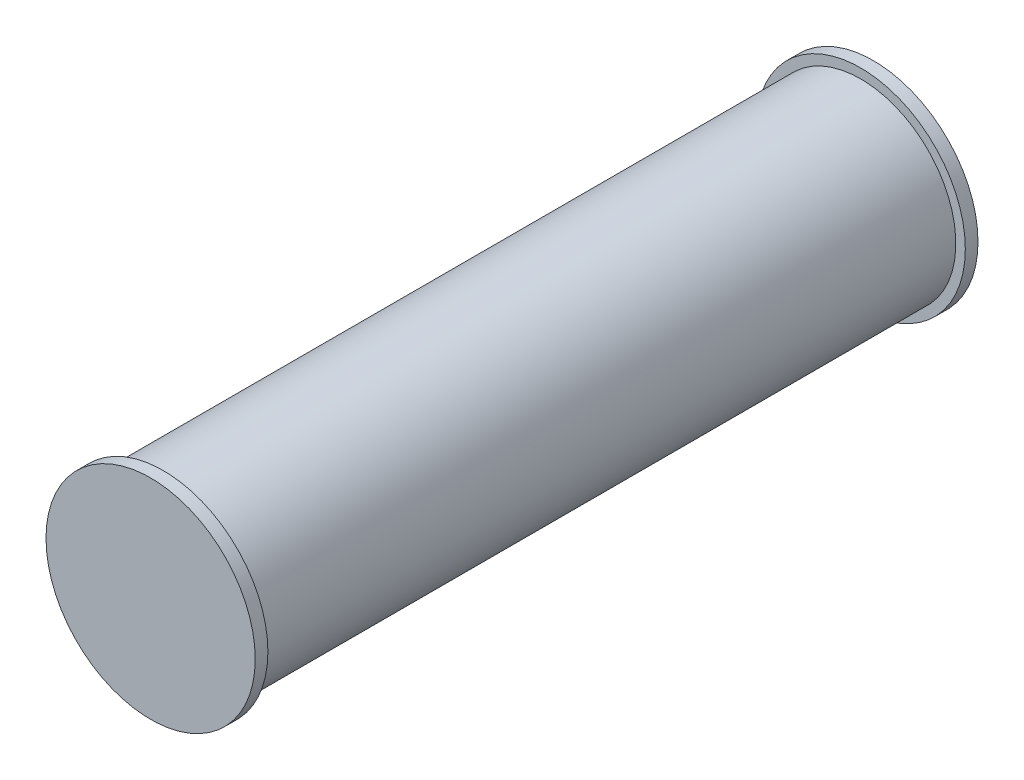
ISO-10303-21;
HEADER;
FILE_DESCRIPTION(('STEP AP214'),'2;1');
FILE_NAME('part.step','',(''),(''),'','','');
FILE_SCHEMA(('AUTOMOTIVE_DESIGN { 1 0 10303 214 1 1 1 1 }'));
ENDSEC;
DATA;
#1=APPLICATION_CONTEXT('core data for automotive mechanical design processes');
#2=APPLICATION_PROTOCOL_DEFINITION('international standard','automotive_design',2000,#1);
#3=PRODUCT_CONTEXT('',#1,'mechanical');
#4=PRODUCT('Part','Part','',(#3));
#5=PRODUCT_RELATED_PRODUCT_CATEGORY('part','',(#4));
#6=PRODUCT_DEFINITION_FORMATION('','',#4);
#7=PRODUCT_DEFINITION_CONTEXT('part definition',#1,'design');
#8=PRODUCT_DEFINITION('design','',#6,#7);
#9=PRODUCT_DEFINITION_SHAPE('','',#8);
#10=(LENGTH_UNIT() NAMED_UNIT(*) SI_UNIT(.MILLI.,.METRE.));
#11=(NAMED_UNIT(*) PLANE_ANGLE_UNIT() SI_UNIT($,.RADIAN.));
#12=(NAMED_UNIT(*) SI_UNIT($,.STERADIAN.) SOLID_ANGLE_UNIT());
#13=UNCERTAINTY_MEASURE_WITH_UNIT(LENGTH_MEASURE(1.E-05),#10,'distance_accuracy_value','');
#14=(GEOMETRIC_REPRESENTATION_CONTEXT(3) GLOBAL_UNCERTAINTY_ASSIGNED_CONTEXT((#13)) GLOBAL_UNIT_ASSIGNED_CONTEXT((#10,
#11,#12)) REPRESENTATION_CONTEXT('',''));
#15=CARTESIAN_POINT('',(0.,0.,0.));
#16=DIRECTION('',(0.,0.,1.));
#17=DIRECTION('',(1.,0.,0.));
#18=AXIS2_PLACEMENT_3D('',#15,#16,#17);
#19=CARTESIAN_POINT('',(0.,0.,110.));
#20=DIRECTION('',(0.,0.,-1.));
#21=DIRECTION('',(-1.,0.,0.));
#22=AXIS2_PLACEMENT_3D('',#19,#20,#21);
#23=CYLINDRICAL_SURFACE('',#22,15.);
#24=CARTESIAN_POINT('',(0.,0.,110.));
#25=DIRECTION('',(0.,0.,1.));
#26=DIRECTION('',(1.,0.,0.));
#27=AXIS2_PLACEMENT_3D('',#24,#25,#26);
#28=CIRCLE('',#27,15.);
#29=CARTESIAN_POINT('',(15.,0.,110.));
#30=VERTEX_POINT('',#29);
#31=EDGE_CURVE('E10',#30,#30,#28,.T.);
#32=ORIENTED_EDGE('',*,*,#31,.F.);
#33=EDGE_LOOP('',(#32));
#34=FACE_BOUND('',#33,.T.);
#35=CARTESIAN_POINT('',(0.,0.,0.));
#36=DIRECTION('',(0.,0.,-1.));
#37=DIRECTION('',(-1.,0.,0.));
#38=AXIS2_PLACEMENT_3D('',#35,#36,#37);
#39=CIRCLE('',#38,15.);
#40=CARTESIAN_POINT('',(-15.,0.,0.));
#41=VERTEX_POINT('',#40);
#42=EDGE_CURVE('E37',#41,#41,#39,.T.);
#43=ORIENTED_EDGE('',*,*,#42,.F.);
#44=EDGE_LOOP('',(#43));
#45=FACE_BOUND('',#44,.T.);
#46=ADVANCED_FACE('F31',(#34,#45),#23,.T.);
#47=CARTESIAN_POINT('',(0.,0.,-2.));
#48=DIRECTION('',(0.,0.,1.));
#49=DIRECTION('',(1.,0.,0.));
#50=AXIS2_PLACEMENT_3D('',#47,#48,#49);
#51=CYLINDRICAL_SURFACE('',#50,16.5);
#52=CARTESIAN_POINT('',(0.,0.,-2.));
#53=DIRECTION('',(0.,0.,-1.));
#54=DIRECTION('',(-1.,0.,0.));
#55=AXIS2_PLACEMENT_3D('',#52,#53,#54);
#56=CIRCLE('',#55,16.5);
#57=CARTESIAN_POINT('',(-16.5,0.,-2.));
#58=VERTEX_POINT('',#57);
#59=EDGE_CURVE('E41',#58,#58,#56,.T.);
#60=ORIENTED_EDGE('',*,*,#59,.F.);
#61=EDGE_LOOP('',(#60));
#62=FACE_BOUND('',#61,.T.);
#63=CARTESIAN_POINT('',(0.,0.,0.));
#64=DIRECTION('',(0.,0.,-1.));
#65=DIRECTION('',(-1.,0.,0.));
#66=AXIS2_PLACEMENT_3D('',#63,#64,#65);
#67=CIRCLE('',#66,16.5);
#68=CARTESIAN_POINT('',(-16.5,0.,0.));
#69=VERTEX_POINT('',#68);
#70=EDGE_CURVE('E45',#69,#69,#67,.T.);
#71=ORIENTED_EDGE('',*,*,#70,.T.);
#72=EDGE_LOOP('',(#71));
#73=FACE_BOUND('',#72,.T.);
#74=ADVANCED_FACE('F74',(#62,#73),#51,.T.);
#75=CARTESIAN_POINT('',(0.,0.,-2.));
#76=DIRECTION('',(0.,0.,-1.));
#77=DIRECTION('',(-1.,0.,0.));
#78=AXIS2_PLACEMENT_3D('',#75,#76,#77);
#79=PLANE('',#78);
#80=ORIENTED_EDGE('',*,*,#59,.T.);
#81=EDGE_LOOP('',(#80));
#82=FACE_BOUND('',#81,.T.);
#83=ADVANCED_FACE('F79',(#82),#79,.T.);
#84=CARTESIAN_POINT('',(0.,0.,0.));
#85=DIRECTION('',(0.,0.,-1.));
#86=DIRECTION('',(-1.,0.,0.));
#87=AXIS2_PLACEMENT_3D('',#84,#85,#86);
#88=PLANE('',#87);
#89=ORIENTED_EDGE('',*,*,#42,.T.);
#90=EDGE_LOOP('',(#89));
#91=FACE_BOUND('',#90,.T.);
#92=ORIENTED_EDGE('',*,*,#70,.F.);
#93=EDGE_LOOP('',(#92));
#94=FACE_BOUND('',#93,.T.);
#95=ADVANCED_FACE('F62',(#91,#94),#88,.F.);
#96=CARTESIAN_POINT('',(0.,0.,112.));
#97=DIRECTION('',(0.,0.,-1.));
#98=DIRECTION('',(-1.,0.,0.));
#99=AXIS2_PLACEMENT_3D('',#96,#97,#98);
#100=CYLINDRICAL_SURFACE('',#99,16.5);
#101=CARTESIAN_POINT('',(0.,0.,112.));
#102=DIRECTION('',(0.,0.,1.));
#103=DIRECTION('',(1.,0.,0.));
#104=AXIS2_PLACEMENT_3D('',#101,#102,#103);
#105=CIRCLE('',#104,16.5);
#106=CARTESIAN_POINT('',(16.5,0.,112.));
#107=VERTEX_POINT('',#106);
#108=EDGE_CURVE('E49',#107,#107,#105,.T.);
#109=ORIENTED_EDGE('',*,*,#108,.F.);
#110=EDGE_LOOP('',(#109));
#111=FACE_BOUND('',#110,.T.);
#112=CARTESIAN_POINT('',(0.,0.,110.));
#113=DIRECTION('',(0.,0.,1.));
#114=DIRECTION('',(1.,0.,0.));
#115=AXIS2_PLACEMENT_3D('',#112,#113,#114);
#116=CIRCLE('',#115,16.5);
#117=CARTESIAN_POINT('',(16.5,0.,110.));
#118=VERTEX_POINT('',#117);
#119=EDGE_CURVE('E51',#118,#118,#116,.T.);
#120=ORIENTED_EDGE('',*,*,#119,.T.);
#121=EDGE_LOOP('',(#120));
#122=FACE_BOUND('',#121,.T.);
#123=ADVANCED_FACE('F59',(#111,#122),#100,.T.);
#124=CARTESIAN_POINT('',(0.,0.,112.));
#125=DIRECTION('',(0.,0.,1.));
#126=DIRECTION('',(1.,0.,0.));
#127=AXIS2_PLACEMENT_3D('',#124,#125,#126);
#128=PLANE('',#127);
#129=ORIENTED_EDGE('',*,*,#108,.T.);
#130=EDGE_LOOP('',(#129));
#131=FACE_BOUND('',#130,.T.);
#132=ADVANCED_FACE('F57',(#131),#128,.T.);
#133=CARTESIAN_POINT('',(0.,0.,110.));
#134=DIRECTION('',(0.,0.,1.));
#135=DIRECTION('',(1.,0.,0.));
#136=AXIS2_PLACEMENT_3D('',#133,#134,#135);
#137=PLANE('',#136);
#138=ORIENTED_EDGE('',*,*,#31,.T.);
#139=EDGE_LOOP('',(#138));
#140=FACE_BOUND('',#139,.T.);
#141=ORIENTED_EDGE('',*,*,#119,.F.);
#142=EDGE_LOOP('',(#141));
#143=FACE_BOUND('',#142,.T.);
#144=ADVANCED_FACE('F66',(#140,#143),#137,.F.);
#145=CLOSED_SHELL('',(#46,#74,#83,#95,#123,#132,#144));
#146=MANIFOLD_SOLID_BREP('B2',#145);
#147=ADVANCED_BREP_SHAPE_REPRESENTATION('',(#18,#146),#14);
#148=SHAPE_DEFINITION_REPRESENTATION(#9,#147);
ENDSEC;
END-ISO-10303-21;
